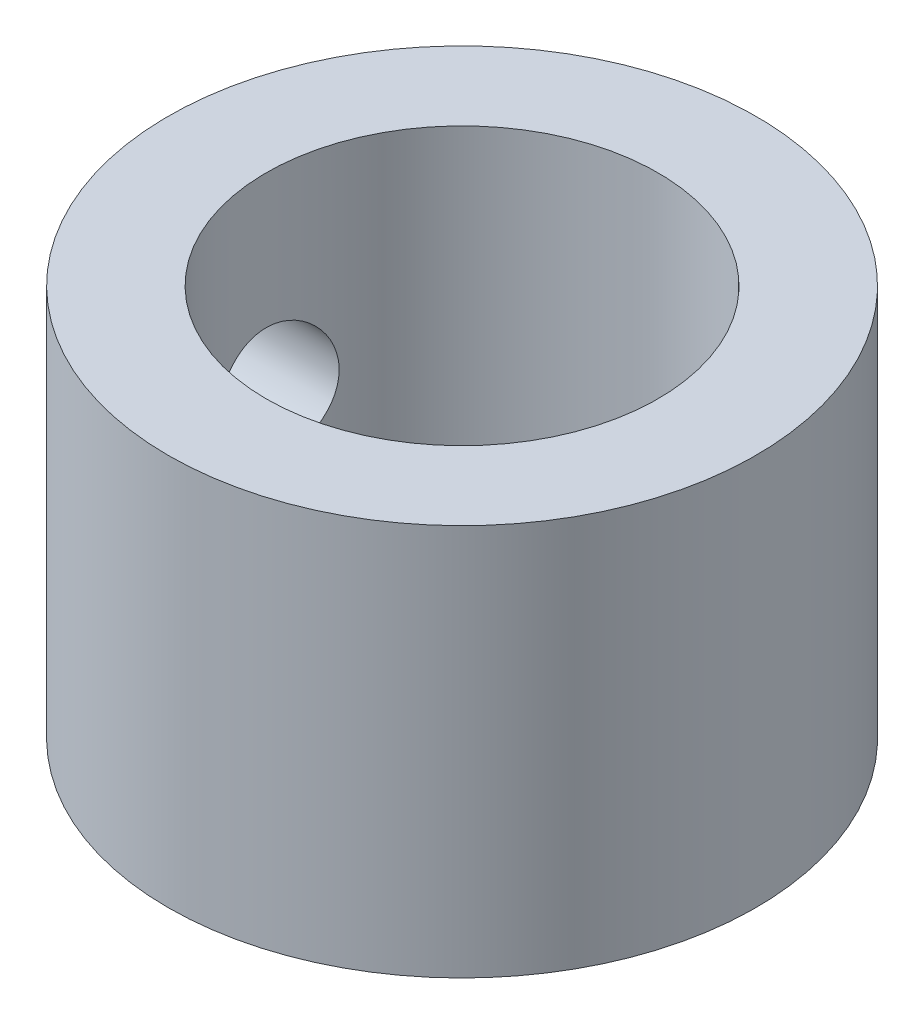
ISO-10303-21;
HEADER;
FILE_DESCRIPTION(('STEP AP214'),'2;1');
FILE_NAME('part.step','',(''),(''),'','','');
FILE_SCHEMA(('AUTOMOTIVE_DESIGN { 1 0 10303 214 1 1 1 1 }'));
ENDSEC;
DATA;
#1=APPLICATION_CONTEXT('core data for automotive mechanical design processes');
#2=APPLICATION_PROTOCOL_DEFINITION('international standard','automotive_design',2000,#1);
#3=PRODUCT_CONTEXT('',#1,'mechanical');
#4=PRODUCT('Part','Part','',(#3));
#5=PRODUCT_RELATED_PRODUCT_CATEGORY('part','',(#4));
#6=PRODUCT_DEFINITION_FORMATION('','',#4);
#7=PRODUCT_DEFINITION_CONTEXT('part definition',#1,'design');
#8=PRODUCT_DEFINITION('design','',#6,#7);
#9=PRODUCT_DEFINITION_SHAPE('','',#8);
#10=(LENGTH_UNIT() NAMED_UNIT(*) SI_UNIT(.MILLI.,.METRE.));
#11=(NAMED_UNIT(*) PLANE_ANGLE_UNIT() SI_UNIT($,.RADIAN.));
#12=(NAMED_UNIT(*) SI_UNIT($,.STERADIAN.) SOLID_ANGLE_UNIT());
#13=UNCERTAINTY_MEASURE_WITH_UNIT(LENGTH_MEASURE(1.E-05),#10,'distance_accuracy_value','');
#14=(GEOMETRIC_REPRESENTATION_CONTEXT(3) GLOBAL_UNCERTAINTY_ASSIGNED_CONTEXT((#13)) GLOBAL_UNIT_ASSIGNED_CONTEXT((#10,
#11,#12)) REPRESENTATION_CONTEXT('',''));
#15=CARTESIAN_POINT('',(0.,0.,0.));
#16=DIRECTION('',(0.,0.,1.));
#17=DIRECTION('',(1.,0.,0.));
#18=AXIS2_PLACEMENT_3D('',#15,#16,#17);
#19=CARTESIAN_POINT('',(0.,12.7,0.));
#20=DIRECTION('',(0.,-1.,0.));
#21=DIRECTION('',(0.,0.,-1.));
#22=AXIS2_PLACEMENT_3D('',#19,#20,#21);
#23=CYLINDRICAL_SURFACE('',#22,9.525);
#24=CARTESIAN_POINT('',(-9.525,4.28676958831981,0.));
#25=CARTESIAN_POINT('',(-9.52499791346595,4.28677353269171,-0.112768925253996));
#26=CARTESIAN_POINT('',(-9.52297693827064,4.29618871410885,-0.225586149919865));
#27=CARTESIAN_POINT('',(-9.5151099890719,4.33356431130629,-0.448020700340186));
#28=CARTESIAN_POINT('',(-9.5092611912389,4.36153841843225,-0.557635601290913));
#29=CARTESIAN_POINT('',(-9.4943903748433,4.43511949730122,-0.770418296829438));
#30=CARTESIAN_POINT('',(-9.48537159069534,4.48070850082402,-0.873592537095481));
#31=CARTESIAN_POINT('',(-9.46513626569556,4.5881692999752,-1.07082305231338));
#32=CARTESIAN_POINT('',(-9.45391980345583,4.65004051320769,-1.16487965322806));
#33=CARTESIAN_POINT('',(-9.43032760593804,4.7893121830109,-1.34264932598538));
#34=CARTESIAN_POINT('',(-9.41793807938239,4.86691401236069,-1.42620281869719));
#35=CARTESIAN_POINT('',(-9.39349423176146,5.03501159714903,-1.5792113643373));
#36=CARTESIAN_POINT('',(-9.38143993951873,5.12550845719661,-1.64866520822995));
#37=CARTESIAN_POINT('',(-9.35889582308482,5.31799764404588,-1.77219962764328));
#38=CARTESIAN_POINT('',(-9.34842369333043,5.42010037133172,-1.82611169578509));
#39=CARTESIAN_POINT('',(-9.3304269515793,5.63217624078097,-1.91595171928336));
#40=CARTESIAN_POINT('',(-9.32290200554748,5.74214848933748,-1.9518817128642));
#41=CARTESIAN_POINT('',(-9.31179182983713,5.96511474458992,-2.00421302910555));
#42=CARTESIAN_POINT('',(-9.30814981199718,6.07803972358791,-2.02089614496564));
#43=CARTESIAN_POINT('',(-9.30504719382578,6.30514000439119,-2.0351360629421));
#44=CARTESIAN_POINT('',(-9.30558610538203,6.41931515868771,-2.03269509774333));
#45=CARTESIAN_POINT('',(-9.31073298847005,6.64358981182624,-2.0089832287703));
#46=CARTESIAN_POINT('',(-9.3152704962147,6.75372564514243,-1.98803838667634));
#47=CARTESIAN_POINT('',(-9.32779203859377,6.96888341597669,-1.92842932620237));
#48=CARTESIAN_POINT('',(-9.33577625811321,7.07390507882928,-1.88976415727976));
#49=CARTESIAN_POINT('',(-9.35436181168287,7.27677678258885,-1.79550908656929));
#50=CARTESIAN_POINT('',(-9.36498259333773,7.37456618740489,-1.73979266768441));
#51=CARTESIAN_POINT('',(-9.3876324866255,7.55952874412034,-1.61310573005908));
#52=CARTESIAN_POINT('',(-9.39966178125667,7.64670051353608,-1.54213322819882));
#53=CARTESIAN_POINT('',(-9.42407650984777,7.80983182579626,-1.38521689874457));
#54=CARTESIAN_POINT('',(-9.43646418380952,7.88552428800687,-1.29899549918545));
#55=CARTESIAN_POINT('',(-9.45997451507497,8.02141720370288,-1.11494412355129));
#56=CARTESIAN_POINT('',(-9.47109715157519,8.08161740243923,-1.01711395662463));
#57=CARTESIAN_POINT('',(-9.49085757325858,8.18487796557926,-0.812304803920622));
#58=CARTESIAN_POINT('',(-9.49949046807199,8.22790466041793,-0.705308340874716));
#59=CARTESIAN_POINT('',(-9.51326216216943,8.29529515164924,-0.485379455095654));
#60=CARTESIAN_POINT('',(-9.51840144426409,8.31966152692149,-0.372447854912028));
#61=CARTESIAN_POINT('',(-9.52453857272057,8.34865431465331,-0.146146579120706));
#62=CARTESIAN_POINT('',(-9.52561299241834,8.35364575692102,-0.0328256857571969));
#63=CARTESIAN_POINT('',(-9.52371335655847,8.34473450867993,0.193030711890559));
#64=CARTESIAN_POINT('',(-9.52073956154609,8.33083303412944,0.305566266251115));
#65=CARTESIAN_POINT('',(-9.51112583851598,8.28483344229508,0.52545749922292));
#66=CARTESIAN_POINT('',(-9.50452425465953,8.25292555169285,0.632854796435832));
#67=CARTESIAN_POINT('',(-9.48839336167702,8.17202904679201,0.840773522657088));
#68=CARTESIAN_POINT('',(-9.47886381166629,8.12303902709669,0.941294385106827));
#69=CARTESIAN_POINT('',(-9.45774453488354,8.00859974355464,1.13412517748171));
#70=CARTESIAN_POINT('',(-9.44612840462098,7.94293445464598,1.22630394786787));
#71=CARTESIAN_POINT('',(-9.42218068404324,7.7972945001614,1.39846502123871));
#72=CARTESIAN_POINT('',(-9.40984900577075,7.71731807288882,1.47844582040917));
#73=CARTESIAN_POINT('',(-9.38559743165083,7.54365481999265,1.6253736550298));
#74=CARTESIAN_POINT('',(-9.3736884952808,7.44975285669154,1.69206854286559));
#75=CARTESIAN_POINT('',(-9.35187764797787,7.25186562470002,1.8087417381795));
#76=CARTESIAN_POINT('',(-9.34197565179383,7.14788078458923,1.8587207557758));
#77=CARTESIAN_POINT('',(-9.32539132083335,6.93332947799793,1.94021465179854));
#78=CARTESIAN_POINT('',(-9.31869127663303,6.82280310429127,1.97183130358559));
#79=CARTESIAN_POINT('',(-9.30923575067856,6.59784608645263,2.01600453896454));
#80=CARTESIAN_POINT('',(-9.30647967328162,6.48341603455202,2.028564000711));
#81=CARTESIAN_POINT('',(-9.30526036020316,6.25643893157811,2.03414852075526));
#82=CARTESIAN_POINT('',(-9.30670935925908,6.14390199221343,2.02757294360195));
#83=CARTESIAN_POINT('',(-9.31353915566394,5.92157886307861,1.99596347067249));
#84=CARTESIAN_POINT('',(-9.3189199112711,5.81179264411804,1.9709297708584));
#85=CARTESIAN_POINT('',(-9.33296519659979,5.5983859076481,1.90330331507403));
#86=CARTESIAN_POINT('',(-9.34161935588561,5.4947471018312,1.8607659751809));
#87=CARTESIAN_POINT('',(-9.36124092234144,5.29601689203192,1.75938836198643));
#88=CARTESIAN_POINT('',(-9.37220855682462,5.20092632927738,1.70054648648584));
#89=CARTESIAN_POINT('',(-9.39548536446913,5.02001719795896,1.56689380534653));
#90=CARTESIAN_POINT('',(-9.40781630884059,4.93441250403802,1.49179724161739));
#91=CARTESIAN_POINT('',(-9.43228117904816,4.77688858249811,1.32834932205462));
#92=CARTESIAN_POINT('',(-9.44441505879474,4.70497251539048,1.23999491357196));
#93=CARTESIAN_POINT('',(-9.46729408454186,4.57602981820966,1.05124020633993));
#94=CARTESIAN_POINT('',(-9.47802046563556,4.51919570475813,0.950706002446454));
#95=CARTESIAN_POINT('',(-9.49668883886092,4.42332126015297,0.741306670837043));
#96=CARTESIAN_POINT('',(-9.50463321701976,4.3842656723099,0.632448780182706));
#97=CARTESIAN_POINT('',(-9.51538736380229,4.33219778941926,0.436200249141966));
#98=CARTESIAN_POINT('',(-9.51897014457218,4.31519407471263,0.349888601275072));
#99=CARTESIAN_POINT('',(-9.52377722809661,4.29247866504171,0.17572770452546));
#100=CARTESIAN_POINT('',(-9.52500162599332,4.28676651455144,0.0878785178146165));
#101=CARTESIAN_POINT('',(-9.525,4.28676958831981,0.));
#102=B_SPLINE_CURVE_WITH_KNOTS('',3,(#24,#25,#26,#27,#28,#29,#30,#31,#32,#33,#34,#35,#36,#37,
#38,#39,#40,#41,#42,#43,#44,#45,#46,#47,#48,#49,#50,#51,#52,#53,#54,#55,#56,#57,#58,#59,#60,#61,
#62,#63,#64,#65,#66,#67,#68,#69,#70,#71,#72,#73,#74,#75,#76,#77,#78,#79,#80,#81,#82,#83,#84,#85,
#86,#87,#88,#89,#90,#91,#92,#93,#94,#95,#96,#97,#98,#99,#100,#101),.UNSPECIFIED.,.T.,.F.,(4,2,2,
2,2,2,2,2,2,2,2,2,2,2,2,2,2,2,2,2,2,2,2,2,2,2,2,2,2,2,2,2,2,2,2,2,2,2,4),(0.,0.337985160775549,
0.676219938638435,1.01411060432242,1.3519891856892,1.69450243763222,2.03704504746841,
2.38317276883145,2.72926124856942,3.07021564180645,3.41113023013143,3.74615468902227,
4.0811971211881,4.41878838664536,4.75642356174964,5.10099386520716,5.44556983428912,
5.79081808302802,6.13601860941049,6.47468295109539,6.8133254971929,7.14845572331699,
7.48361352809281,7.82335697246671,8.16314226795905,8.50886441864446,8.8545718806075,
9.19834450987437,9.54206521494487,9.87866395980484,10.2152591311904,10.5507967512134,
10.8863673552419,11.2284016307086,11.5705147815387,11.9168050322725,12.2627975502728,
12.5261931018932,12.7895780273537),.UNSPECIFIED.);
#103=CARTESIAN_POINT('',(-9.525,4.28676958831981,0.));
#104=VERTEX_POINT('',#103);
#105=EDGE_CURVE('E70',#104,#104,#102,.T.);
#106=ORIENTED_EDGE('',*,*,#105,.T.);
#107=EDGE_LOOP('',(#106));
#108=FACE_BOUND('',#107,.T.);
#109=CARTESIAN_POINT('',(0.,12.7,0.));
#110=DIRECTION('',(0.,1.,0.));
#111=DIRECTION('',(0.,0.,1.));
#112=AXIS2_PLACEMENT_3D('',#109,#110,#111);
#113=CIRCLE('',#112,9.525);
#114=CARTESIAN_POINT('',(0.,12.7,9.525));
#115=VERTEX_POINT('',#114);
#116=EDGE_CURVE('E10',#115,#115,#113,.T.);
#117=ORIENTED_EDGE('',*,*,#116,.F.);
#118=EDGE_LOOP('',(#117));
#119=FACE_BOUND('',#118,.T.);
#120=CARTESIAN_POINT('',(0.,0.,0.));
#121=DIRECTION('',(0.,1.,0.));
#122=DIRECTION('',(0.,0.,1.));
#123=AXIS2_PLACEMENT_3D('',#120,#121,#122);
#124=CIRCLE('',#123,9.525);
#125=CARTESIAN_POINT('',(0.,0.,9.525));
#126=VERTEX_POINT('',#125);
#127=EDGE_CURVE('E51',#126,#126,#124,.T.);
#128=ORIENTED_EDGE('',*,*,#127,.T.);
#129=EDGE_LOOP('',(#128));
#130=FACE_BOUND('',#129,.T.);
#131=ADVANCED_FACE('F42',(#108,#119,#130),#23,.T.);
#132=CARTESIAN_POINT('',(0.,12.7,0.));
#133=DIRECTION('',(0.,1.,0.));
#134=DIRECTION('',(0.,0.,1.));
#135=AXIS2_PLACEMENT_3D('',#132,#133,#134);
#136=PLANE('',#135);
#137=CARTESIAN_POINT('',(0.,12.7,0.));
#138=DIRECTION('',(0.,1.,0.));
#139=DIRECTION('',(0.,0.,1.));
#140=AXIS2_PLACEMENT_3D('',#137,#138,#139);
#141=CIRCLE('',#140,6.35);
#142=CARTESIAN_POINT('',(0.,12.7,6.35));
#143=VERTEX_POINT('',#142);
#144=EDGE_CURVE('E60',#143,#143,#141,.T.);
#145=ORIENTED_EDGE('',*,*,#144,.F.);
#146=EDGE_LOOP('',(#145));
#147=FACE_BOUND('',#146,.T.);
#148=ORIENTED_EDGE('',*,*,#116,.T.);
#149=EDGE_LOOP('',(#148));
#150=FACE_BOUND('',#149,.T.);
#151=ADVANCED_FACE('F100',(#147,#150),#136,.T.);
#152=CARTESIAN_POINT('',(0.,0.,0.));
#153=DIRECTION('',(0.,1.,0.));
#154=DIRECTION('',(0.,0.,1.));
#155=AXIS2_PLACEMENT_3D('',#152,#153,#154);
#156=PLANE('',#155);
#157=CARTESIAN_POINT('',(0.,0.,0.));
#158=DIRECTION('',(0.,-1.,0.));
#159=DIRECTION('',(0.,0.,-1.));
#160=AXIS2_PLACEMENT_3D('',#157,#158,#159);
#161=CIRCLE('',#160,5.23875);
#162=CARTESIAN_POINT('',(0.,0.,-5.23875));
#163=VERTEX_POINT('',#162);
#164=EDGE_CURVE('E90',#163,#163,#161,.T.);
#165=ORIENTED_EDGE('',*,*,#164,.F.);
#166=EDGE_LOOP('',(#165));
#167=FACE_BOUND('',#166,.T.);
#168=ORIENTED_EDGE('',*,*,#127,.F.);
#169=EDGE_LOOP('',(#168));
#170=FACE_BOUND('',#169,.T.);
#171=ADVANCED_FACE('F102',(#167,#170),#156,.F.);
#172=CARTESIAN_POINT('',(0.,3.175,0.));
#173=DIRECTION('',(0.,1.,0.));
#174=DIRECTION('',(0.,0.,1.));
#175=AXIS2_PLACEMENT_3D('',#172,#173,#174);
#176=CYLINDRICAL_SURFACE('',#175,6.35);
#177=CARTESIAN_POINT('',(-6.01610139542212,6.31876958831981,-2.032));
#178=CARTESIAN_POINT('',(-6.01610174451805,6.20781446608152,-2.0319996745482));
#179=CARTESIAN_POINT('',(-6.019204491835,6.09685549855364,-2.02288131321408));
#180=CARTESIAN_POINT('',(-6.03122202316988,5.87820711204009,-1.98675966849085));
#181=CARTESIAN_POINT('',(-6.04013815558328,5.77051845765908,-1.95975223576754));
#182=CARTESIAN_POINT('',(-6.06267140856264,5.5616106992366,-1.8888839779082));
#183=CARTESIAN_POINT('',(-6.07627989305598,5.46038011218635,-1.84505409711977));
#184=CARTESIAN_POINT('',(-6.10665232248794,5.26667918422169,-1.74188925757098));
#185=CARTESIAN_POINT('',(-6.12341687522398,5.17421053585155,-1.68255131140247));
#186=CARTESIAN_POINT('',(-6.15889000331136,4.99732646650256,-1.54776477280497));
#187=CARTESIAN_POINT('',(-6.17764421098765,4.91327307816689,-1.47185297106235));
#188=CARTESIAN_POINT('',(-6.2145961587136,4.75884582747267,-1.30706383535932));
#189=CARTESIAN_POINT('',(-6.2327938167406,4.68847397334963,-1.21818460132888));
#190=CARTESIAN_POINT('',(-6.26710650418656,4.56179394898883,-1.02736576652772));
#191=CARTESIAN_POINT('',(-6.28316156553783,4.50586090869706,-0.925165393583459));
#192=CARTESIAN_POINT('',(-6.31084552719743,4.41212041208346,-0.712206085755855));
#193=CARTESIAN_POINT('',(-6.32247552122195,4.37430847628121,-0.601449273866489));
#194=CARTESIAN_POINT('',(-6.33967589079254,4.3190989886998,-0.378313581851225));
#195=CARTESIAN_POINT('',(-6.34542966362611,4.30108216108957,-0.266102323870222));
#196=CARTESIAN_POINT('',(-6.35087818111628,4.28400974433341,-0.0401118449990243));
#197=CARTESIAN_POINT('',(-6.35057436803627,4.28494964174153,0.073666996215177));
#198=CARTESIAN_POINT('',(-6.3440684394932,4.30536175582473,0.295195614417038));
#199=CARTESIAN_POINT('',(-6.33808013735214,4.3241621955774,0.403014581705481));
#200=CARTESIAN_POINT('',(-6.32114298346381,4.37865640383607,0.613877732935031));
#201=CARTESIAN_POINT('',(-6.31019380321791,4.41435129106285,0.716921600181181));
#202=CARTESIAN_POINT('',(-6.28428336742623,4.50203869361745,0.916830716010905));
#203=CARTESIAN_POINT('',(-6.26927338129665,4.55423054894364,1.01360195027934));
#204=CARTESIAN_POINT('',(-6.23681611943959,4.67326895108098,1.19721812551215));
#205=CARTESIAN_POINT('',(-6.21936820534732,4.74011933880751,1.28406045575573));
#206=CARTESIAN_POINT('',(-6.18298825859758,4.89000389332096,1.44935641705926));
#207=CARTESIAN_POINT('',(-6.1640246859289,4.97361652940286,1.52727931500778));
#208=CARTESIAN_POINT('',(-6.12740181619154,5.15289467976391,1.66816033344735));
#209=CARTESIAN_POINT('',(-6.10974268890679,5.24856175865523,1.73111650825779));
#210=CARTESIAN_POINT('',(-6.07756413873389,5.45079664849228,1.84093515965824));
#211=CARTESIAN_POINT('',(-6.06308573817648,5.55748342404638,1.88759148058084));
#212=CARTESIAN_POINT('',(-6.03938659390605,5.77777601243796,1.96210506426075));
#213=CARTESIAN_POINT('',(-6.03016385176353,5.89137917715263,1.98996947325919));
#214=CARTESIAN_POINT('',(-6.01846690355154,6.11717475413478,2.02506444352912));
#215=CARTESIAN_POINT('',(-6.01572589529939,6.22922652169202,2.03311134847854));
#216=CARTESIAN_POINT('',(-6.01656021447771,6.45309021190401,2.0306419624206));
#217=CARTESIAN_POINT('',(-6.02013450706791,6.56490217084856,2.02012871272471));
#218=CARTESIAN_POINT('',(-6.03293236061661,6.78152841304628,1.98156846947786));
#219=CARTESIAN_POINT('',(-6.0419785750599,6.88645215462706,1.95407135945648));
#220=CARTESIAN_POINT('',(-6.06451054153907,7.09018176118977,1.88297454608377));
#221=CARTESIAN_POINT('',(-6.07799704047178,7.1889865935904,1.83937213352148));
#222=CARTESIAN_POINT('',(-6.10838811805446,7.38093135421524,1.73582277174388));
#223=CARTESIAN_POINT('',(-6.12538252181103,7.47381497800762,1.67542777633699));
#224=CARTESIAN_POINT('',(-6.16069277552723,7.64842583449324,1.54052523701905));
#225=CARTESIAN_POINT('',(-6.17900898441997,7.73015001931037,1.46601385083987));
#226=CARTESIAN_POINT('',(-6.21586910903942,7.88381485882525,1.30111624212246));
#227=CARTESIAN_POINT('',(-6.23438789831714,7.95517068633114,1.21017790919235));
#228=CARTESIAN_POINT('',(-6.26876909222107,8.08163763646124,1.01716698380556));
#229=CARTESIAN_POINT('',(-6.28463161024603,8.1367494526341,0.915094866968043));
#230=CARTESIAN_POINT('',(-6.31182747235698,8.22864130484981,0.70330537634841));
#231=CARTESIAN_POINT('',(-6.32319253698897,8.26555019870531,0.593648197456969));
#232=CARTESIAN_POINT('',(-6.34025179322111,8.32026940054045,0.369252478188006));
#233=CARTESIAN_POINT('',(-6.3459478546721,8.33808600602498,0.254515626328799));
#234=CARTESIAN_POINT('',(-6.35089728699516,8.3535835373525,0.028588506656381));
#235=CARTESIAN_POINT('',(-6.35042034344403,8.35210729840778,-0.082538702707938));
#236=CARTESIAN_POINT('',(-6.34372970008315,8.33111369065146,-0.302889206146054));
#237=CARTESIAN_POINT('',(-6.33751640569219,8.31159759681336,-0.412112634214495));
#238=CARTESIAN_POINT('',(-6.32014146380338,8.25562338444704,-0.624081862822167));
#239=CARTESIAN_POINT('',(-6.30904856424295,8.21940031531382,-0.72689576308792));
#240=CARTESIAN_POINT('',(-6.28305733444808,8.13125439416303,-0.925033122122286));
#241=CARTESIAN_POINT('',(-6.26815833726946,8.07932879028992,-1.02035526427475));
#242=CARTESIAN_POINT('',(-6.23545303830943,7.95915098143227,-1.20443987795144));
#243=CARTESIAN_POINT('',(-6.21756316223599,7.89039047833993,-1.29285549497061));
#244=CARTESIAN_POINT('',(-6.1811202766997,7.73937980800283,-1.45717159390929));
#245=CARTESIAN_POINT('',(-6.16256706553486,7.65712550990937,-1.53306822908581));
#246=CARTESIAN_POINT('',(-6.12611846272476,7.47799174836081,-1.67289729585392));
#247=CARTESIAN_POINT('',(-6.10826927227698,7.38069913568498,-1.73631403940874));
#248=CARTESIAN_POINT('',(-6.07607329133501,7.17629301211933,-1.84583563626116));
#249=CARTESIAN_POINT('',(-6.06172525663277,7.06918300871092,-1.89194664265355));
#250=CARTESIAN_POINT('',(-6.03917852750268,6.85600138010397,-1.96267840110957));
#251=CARTESIAN_POINT('',(-6.03061498798879,6.75039794030578,-1.9885945884552));
#252=CARTESIAN_POINT('',(-6.01907702900866,6.53612018377735,-2.02325315661773));
#253=CARTESIAN_POINT('',(-6.01610105349336,6.42744673055751,-2.03200031877007));
#254=CARTESIAN_POINT('',(-6.01610139542212,6.31876958831981,-2.032));
#255=B_SPLINE_CURVE_WITH_KNOTS('',3,(#177,#178,#179,#180,#181,#182,#183,#184,#185,#186,#187,
#188,#189,#190,#191,#192,#193,#194,#195,#196,#197,#198,#199,#200,#201,#202,#203,#204,#205,#206,
#207,#208,#209,#210,#211,#212,#213,#214,#215,#216,#217,#218,#219,#220,#221,#222,#223,#224,#225,
#226,#227,#228,#229,#230,#231,#232,#233,#234,#235,#236,#237,#238,#239,#240,#241,#242,#243,#244,
#245,#246,#247,#248,#249,#250,#251,#252,#253,#254),.UNSPECIFIED.,.T.,.F.,(4,2,2,2,2,2,2,2,2,2,2,
2,2,2,2,2,2,2,2,2,2,2,2,2,2,2,2,2,2,2,2,2,2,2,2,2,2,2,4),(0.,0.332463568099399,0.66500427747215,
0.996936198139612,1.32893210795917,1.67177995865548,2.01467809612903,2.36574809413662,
2.71673126391656,3.05639056512854,3.39596899710858,3.72326061801578,4.0505739146349,
4.38200406396324,4.71352116057682,5.05949036771806,5.40550452644428,5.75574873508564,
6.10585967665649,6.44128748992316,6.77666034428521,7.10170609557038,7.42680655050751,
7.76158789681107,8.09646049679158,8.44599113933574,8.79550685627895,9.14251152045365,
9.48940169144636,9.82119007081545,10.1529550027092,10.4801884106383,10.8074791992043,
11.1462374404218,11.4850995797152,11.835899632827,12.1865748397405,12.5123034407979,
12.8379413180795),.UNSPECIFIED.);
#256=CARTESIAN_POINT('',(-6.01610139542212,6.31876958831981,-2.032));
#257=VERTEX_POINT('',#256);
#258=EDGE_CURVE('E62',#257,#257,#255,.T.);
#259=ORIENTED_EDGE('',*,*,#258,.T.);
#260=EDGE_LOOP('',(#259));
#261=FACE_BOUND('',#260,.T.);
#262=CARTESIAN_POINT('',(0.,3.175,0.));
#263=DIRECTION('',(0.,1.,0.));
#264=DIRECTION('',(0.,0.,1.));
#265=AXIS2_PLACEMENT_3D('',#262,#263,#264);
#266=CIRCLE('',#265,6.35);
#267=CARTESIAN_POINT('',(0.,3.175,6.35));
#268=VERTEX_POINT('',#267);
#269=EDGE_CURVE('E57',#268,#268,#266,.T.);
#270=ORIENTED_EDGE('',*,*,#269,.F.);
#271=EDGE_LOOP('',(#270));
#272=FACE_BOUND('',#271,.T.);
#273=ORIENTED_EDGE('',*,*,#144,.T.);
#274=EDGE_LOOP('',(#273));
#275=FACE_BOUND('',#274,.T.);
#276=ADVANCED_FACE('F71',(#261,#272,#275),#176,.F.);
#277=CARTESIAN_POINT('',(0.,3.175,0.));
#278=DIRECTION('',(0.,1.,0.));
#279=DIRECTION('',(0.,0.,1.));
#280=AXIS2_PLACEMENT_3D('',#277,#278,#279);
#281=PLANE('',#280);
#282=CARTESIAN_POINT('',(0.,3.175,0.));
#283=DIRECTION('',(0.,1.,0.));
#284=DIRECTION('',(0.,0.,1.));
#285=AXIS2_PLACEMENT_3D('',#282,#283,#284);
#286=CIRCLE('',#285,5.23875);
#287=CARTESIAN_POINT('',(0.,3.175,5.23875));
#288=VERTEX_POINT('',#287);
#289=EDGE_CURVE('E46',#288,#288,#286,.T.);
#290=ORIENTED_EDGE('',*,*,#289,.F.);
#291=EDGE_LOOP('',(#290));
#292=FACE_BOUND('',#291,.T.);
#293=ORIENTED_EDGE('',*,*,#269,.T.);
#294=EDGE_LOOP('',(#293));
#295=FACE_BOUND('',#294,.T.);
#296=ADVANCED_FACE('F80',(#292,#295),#281,.T.);
#297=CARTESIAN_POINT('',(-9.525,6.31876958831981,0.));
#298=DIRECTION('',(1.,0.,0.));
#299=DIRECTION('',(0.,0.,-1.));
#300=AXIS2_PLACEMENT_3D('',#297,#298,#299);
#301=CYLINDRICAL_SURFACE('',#300,2.032);
#302=ORIENTED_EDGE('',*,*,#258,.F.);
#303=EDGE_LOOP('',(#302));
#304=FACE_BOUND('',#303,.T.);
#305=ORIENTED_EDGE('',*,*,#105,.F.);
#306=EDGE_LOOP('',(#305));
#307=FACE_BOUND('',#306,.T.);
#308=ADVANCED_FACE('F75',(#304,#307),#301,.F.);
#309=CARTESIAN_POINT('',(0.,12.7,0.));
#310=DIRECTION('',(0.,-1.,0.));
#311=DIRECTION('',(0.,0.,-1.));
#312=AXIS2_PLACEMENT_3D('',#309,#310,#311);
#313=CYLINDRICAL_SURFACE('',#312,5.23875);
#314=ORIENTED_EDGE('',*,*,#289,.T.);
#315=EDGE_LOOP('',(#314));
#316=FACE_BOUND('',#315,.T.);
#317=ORIENTED_EDGE('',*,*,#164,.T.);
#318=EDGE_LOOP('',(#317));
#319=FACE_BOUND('',#318,.T.);
#320=ADVANCED_FACE('F79',(#316,#319),#313,.F.);
#321=CLOSED_SHELL('',(#131,#151,#171,#276,#296,#308,#320));
#322=MANIFOLD_SOLID_BREP('B2',#321);
#323=ADVANCED_BREP_SHAPE_REPRESENTATION('',(#18,#322),#14);
#324=SHAPE_DEFINITION_REPRESENTATION(#9,#323);
ENDSEC;
END-ISO-10303-21;
